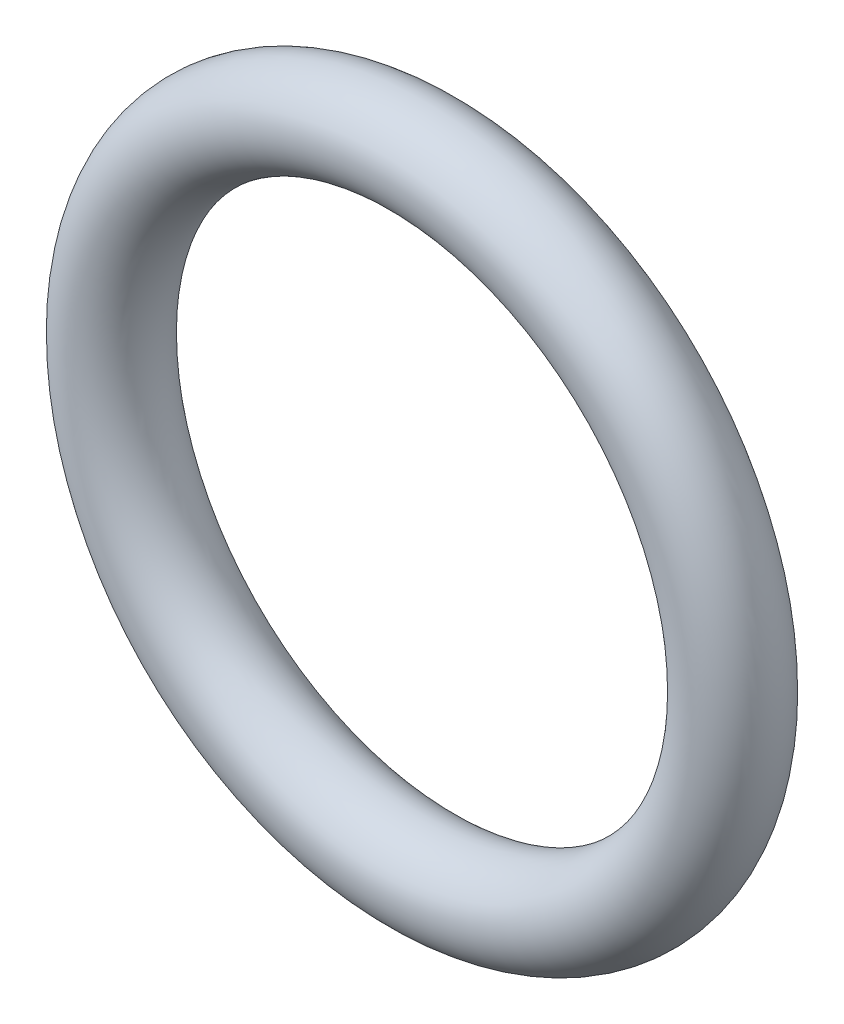
ISO-10303-21;
HEADER;
FILE_DESCRIPTION(('STEP AP214'),'2;1');
FILE_NAME('part.step','',(''),(''),'','','');
FILE_SCHEMA(('AUTOMOTIVE_DESIGN { 1 0 10303 214 1 1 1 1 }'));
ENDSEC;
DATA;
#1=APPLICATION_CONTEXT('core data for automotive mechanical design processes');
#2=APPLICATION_PROTOCOL_DEFINITION('international standard','automotive_design',2000,#1);
#3=PRODUCT_CONTEXT('',#1,'mechanical');
#4=PRODUCT('Part','Part','',(#3));
#5=PRODUCT_RELATED_PRODUCT_CATEGORY('part','',(#4));
#6=PRODUCT_DEFINITION_FORMATION('','',#4);
#7=PRODUCT_DEFINITION_CONTEXT('part definition',#1,'design');
#8=PRODUCT_DEFINITION('design','',#6,#7);
#9=PRODUCT_DEFINITION_SHAPE('','',#8);
#10=(LENGTH_UNIT() NAMED_UNIT(*) SI_UNIT(.MILLI.,.METRE.));
#11=(NAMED_UNIT(*) PLANE_ANGLE_UNIT() SI_UNIT($,.RADIAN.));
#12=(NAMED_UNIT(*) SI_UNIT($,.STERADIAN.) SOLID_ANGLE_UNIT());
#13=UNCERTAINTY_MEASURE_WITH_UNIT(LENGTH_MEASURE(1.E-05),#10,'distance_accuracy_value','');
#14=(GEOMETRIC_REPRESENTATION_CONTEXT(3) GLOBAL_UNCERTAINTY_ASSIGNED_CONTEXT((#13)) GLOBAL_UNIT_ASSIGNED_CONTEXT((#10,
#11,#12)) REPRESENTATION_CONTEXT('',''));
#15=CARTESIAN_POINT('',(0.,0.,0.));
#16=DIRECTION('',(0.,0.,1.));
#17=DIRECTION('',(1.,0.,0.));
#18=AXIS2_PLACEMENT_3D('',#15,#16,#17);
#19=CARTESIAN_POINT('',(0.,0.,0.));
#20=DIRECTION('',(0.,0.,1.));
#21=DIRECTION('',(1.,0.,0.));
#22=AXIS2_PLACEMENT_3D('',#19,#20,#21);
#23=TOROIDAL_SURFACE('',#22,13.5,2.);
#24=CARTESIAN_POINT('',(-13.5,0.,0.));
#25=DIRECTION('',(0.,1.,0.));
#26=DIRECTION('',(0.,0.,1.));
#27=AXIS2_PLACEMENT_3D('',#24,#25,#26);
#28=CIRCLE('',#27,2.);
#29=CARTESIAN_POINT('',(-15.5,0.,0.));
#30=VERTEX_POINT('',#29);
#31=EDGE_CURVE('E10',#30,#30,#28,.T.);
#32=CARTESIAN_POINT('',(0.,0.,0.));
#33=DIRECTION('',(0.,0.,1.));
#34=DIRECTION('',(1.,0.,0.));
#35=AXIS2_PLACEMENT_3D('',#32,#33,#34);
#36=CIRCLE('',#35,15.5);
#37=EDGE_CURVE('',#30,#30,#36,.T.);
#38=ORIENTED_EDGE('',*,*,#31,.F.);
#39=ORIENTED_EDGE('',*,*,#31,.T.);
#40=ORIENTED_EDGE('',*,*,#37,.T.);
#41=ORIENTED_EDGE('',*,*,#37,.F.);
#42=EDGE_LOOP('',(#38,#40,#39,#41));
#43=FACE_BOUND('',#42,.T.);
#44=ADVANCED_FACE('F37',(#43),#23,.T.);
#45=CLOSED_SHELL('',(#44));
#46=MANIFOLD_SOLID_BREP('B2',#45);
#47=ADVANCED_BREP_SHAPE_REPRESENTATION('',(#18,#46),#14);
#48=SHAPE_DEFINITION_REPRESENTATION(#9,#47);
ENDSEC;
END-ISO-10303-21;
